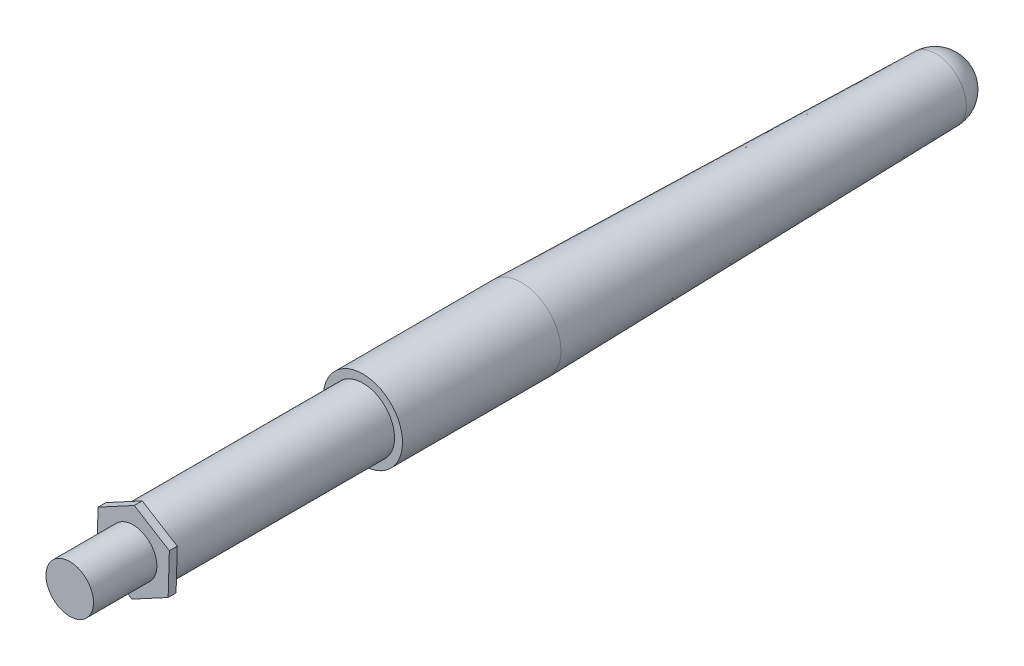
ISO-10303-21;
HEADER;
FILE_DESCRIPTION(('STEP AP214'),'2;1');
FILE_NAME('part.step','',(''),(''),'','','');
FILE_SCHEMA(('AUTOMOTIVE_DESIGN { 1 0 10303 214 1 1 1 1 }'));
ENDSEC;
DATA;
#1=APPLICATION_CONTEXT('core data for automotive mechanical design processes');
#2=APPLICATION_PROTOCOL_DEFINITION('international standard','automotive_design',2000,#1);
#3=PRODUCT_CONTEXT('',#1,'mechanical');
#4=PRODUCT('Part','Part','',(#3));
#5=PRODUCT_RELATED_PRODUCT_CATEGORY('part','',(#4));
#6=PRODUCT_DEFINITION_FORMATION('','',#4);
#7=PRODUCT_DEFINITION_CONTEXT('part definition',#1,'design');
#8=PRODUCT_DEFINITION('design','',#6,#7);
#9=PRODUCT_DEFINITION_SHAPE('','',#8);
#10=(LENGTH_UNIT() NAMED_UNIT(*) SI_UNIT(.MILLI.,.METRE.));
#11=(NAMED_UNIT(*) PLANE_ANGLE_UNIT() SI_UNIT($,.RADIAN.));
#12=(NAMED_UNIT(*) SI_UNIT($,.STERADIAN.) SOLID_ANGLE_UNIT());
#13=UNCERTAINTY_MEASURE_WITH_UNIT(LENGTH_MEASURE(1.E-05),#10,'distance_accuracy_value','');
#14=(GEOMETRIC_REPRESENTATION_CONTEXT(3) GLOBAL_UNCERTAINTY_ASSIGNED_CONTEXT((#13)) GLOBAL_UNIT_ASSIGNED_CONTEXT((#10,
#11,#12)) REPRESENTATION_CONTEXT('',''));
#15=CARTESIAN_POINT('',(0.,0.,0.));
#16=DIRECTION('',(0.,0.,1.));
#17=DIRECTION('',(1.,0.,0.));
#18=AXIS2_PLACEMENT_3D('',#15,#16,#17);
#19=CARTESIAN_POINT('',(0.,0.,-34.));
#20=DIRECTION('',(0.,0.,1.));
#21=DIRECTION('',(1.,0.,0.));
#22=AXIS2_PLACEMENT_3D('',#19,#20,#21);
#23=CYLINDRICAL_SURFACE('',#22,4.);
#24=CARTESIAN_POINT('',(0.,0.,-1.));
#25=DIRECTION('',(0.,0.,-1.));
#26=DIRECTION('',(-1.,0.,0.));
#27=AXIS2_PLACEMENT_3D('',#24,#25,#26);
#28=CIRCLE('',#27,4.);
#29=CARTESIAN_POINT('',(-4.,0.,-1.));
#30=VERTEX_POINT('',#29);
#31=EDGE_CURVE('E172',#30,#30,#28,.T.);
#32=ORIENTED_EDGE('',*,*,#31,.T.);
#33=EDGE_LOOP('',(#32));
#34=FACE_BOUND('',#33,.T.);
#35=CARTESIAN_POINT('',(0.,0.,-29.));
#36=DIRECTION('',(0.,0.,-1.));
#37=DIRECTION('',(-1.,0.,0.));
#38=AXIS2_PLACEMENT_3D('',#35,#36,#37);
#39=CIRCLE('',#38,4.);
#40=CARTESIAN_POINT('',(-4.,0.,-29.));
#41=VERTEX_POINT('',#40);
#42=EDGE_CURVE('E176',#41,#41,#39,.T.);
#43=ORIENTED_EDGE('',*,*,#42,.F.);
#44=EDGE_LOOP('',(#43));
#45=FACE_BOUND('',#44,.T.);
#46=ADVANCED_FACE('F45',(#34,#45),#23,.T.);
#47=CARTESIAN_POINT('',(0.,0.,8.));
#48=DIRECTION('',(0.,0.,-1.));
#49=DIRECTION('',(-1.,0.,0.));
#50=AXIS2_PLACEMENT_3D('',#47,#48,#49);
#51=CYLINDRICAL_SURFACE('',#50,3.);
#52=CARTESIAN_POINT('',(0.,0.,8.));
#53=DIRECTION('',(0.,0.,1.));
#54=DIRECTION('',(1.,0.,0.));
#55=AXIS2_PLACEMENT_3D('',#52,#53,#54);
#56=CIRCLE('',#55,3.);
#57=CARTESIAN_POINT('',(3.,0.,8.));
#58=VERTEX_POINT('',#57);
#59=EDGE_CURVE('E168',#58,#58,#56,.T.);
#60=ORIENTED_EDGE('',*,*,#59,.F.);
#61=EDGE_LOOP('',(#60));
#62=FACE_BOUND('',#61,.T.);
#63=CARTESIAN_POINT('',(0.,0.,0.));
#64=DIRECTION('',(0.,0.,1.));
#65=DIRECTION('',(1.,0.,0.));
#66=AXIS2_PLACEMENT_3D('',#63,#64,#65);
#67=CIRCLE('',#66,3.);
#68=CARTESIAN_POINT('',(3.,0.,0.));
#69=VERTEX_POINT('',#68);
#70=EDGE_CURVE('E167',#69,#69,#67,.T.);
#71=ORIENTED_EDGE('',*,*,#70,.T.);
#72=EDGE_LOOP('',(#71));
#73=FACE_BOUND('',#72,.T.);
#74=ADVANCED_FACE('F201',(#62,#73),#51,.T.);
#75=CARTESIAN_POINT('',(0.,0.,8.));
#76=DIRECTION('',(0.,0.,1.));
#77=DIRECTION('',(1.,0.,0.));
#78=AXIS2_PLACEMENT_3D('',#75,#76,#77);
#79=PLANE('',#78);
#80=ORIENTED_EDGE('',*,*,#59,.T.);
#81=EDGE_LOOP('',(#80));
#82=FACE_BOUND('',#81,.T.);
#83=ADVANCED_FACE('F207',(#82),#79,.T.);
#84=CARTESIAN_POINT('',(-4.57389900943464,-2.46565363575115,-1.));
#85=DIRECTION('',(0.99957413329399,-0.0291813647653501,0.));
#86=DIRECTION('',(0.0291813647653501,0.99957413329399,0.));
#87=AXIS2_PLACEMENT_3D('',#84,#85,#86);
#88=PLANE('',#87);
#89=DIRECTION('',(0.0291813647653501,0.99957413329399,0.));
#90=VECTOR('',#89,1.);
#91=CARTESIAN_POINT('',(-4.57389900943464,-2.46565363575115,0.));
#92=LINE('',#91,#90);
#93=CARTESIAN_POINT('',(-4.57389900943464,-2.46565363575115,0.));
#94=VERTEX_POINT('',#93);
#95=CARTESIAN_POINT('',(-4.42226819021128,2.7282859186393,0.));
#96=VERTEX_POINT('',#95);
#97=EDGE_CURVE('E136',#94,#96,#92,.T.);
#98=ORIENTED_EDGE('',*,*,#97,.T.);
#99=DIRECTION('',(0.,0.,1.));
#100=VECTOR('',#99,1.);
#101=CARTESIAN_POINT('',(-4.42226819021128,2.7282859186393,-1.));
#102=LINE('',#101,#100);
#103=CARTESIAN_POINT('',(-4.42226819021128,2.7282859186393,-1.));
#104=VERTEX_POINT('',#103);
#105=EDGE_CURVE('E164',#104,#96,#102,.T.);
#106=ORIENTED_EDGE('',*,*,#105,.F.);
#107=DIRECTION('',(0.0291813647653501,0.99957413329399,0.));
#108=VECTOR('',#107,1.);
#109=CARTESIAN_POINT('',(-4.57389900943464,-2.46565363575115,-1.));
#110=LINE('',#109,#108);
#111=CARTESIAN_POINT('',(-4.57389900943464,-2.46565363575115,-1.));
#112=VERTEX_POINT('',#111);
#113=EDGE_CURVE('E153',#112,#104,#110,.T.);
#114=ORIENTED_EDGE('',*,*,#113,.F.);
#115=DIRECTION('',(0.,0.,1.));
#116=VECTOR('',#115,1.);
#117=CARTESIAN_POINT('',(-4.57389900943464,-2.46565363575115,-1.));
#118=LINE('',#117,#116);
#119=EDGE_CURVE('E132',#112,#94,#118,.T.);
#120=ORIENTED_EDGE('',*,*,#119,.T.);
#121=EDGE_LOOP('',(#98,#106,#114,#120));
#122=FACE_BOUND('',#121,.T.);
#123=ADVANCED_FACE('F236',(#122),#88,.F.);
#124=CARTESIAN_POINT('',(-4.42226819021128,2.7282859186393,-1.));
#125=DIRECTION('',(0.474515263443102,-0.880247274781083,0.));
#126=DIRECTION('',(0.880247274781083,0.474515263443102,0.));
#127=AXIS2_PLACEMENT_3D('',#124,#125,#126);
#128=PLANE('',#127);
#129=DIRECTION('',(0.880247274781083,0.474515263443102,0.));
#130=VECTOR('',#129,1.);
#131=CARTESIAN_POINT('',(-4.42226819021128,2.7282859186393,0.));
#132=LINE('',#131,#130);
#133=CARTESIAN_POINT('',(0.151630819223359,5.19393955439045,0.));
#134=VERTEX_POINT('',#133);
#135=EDGE_CURVE('E140',#96,#134,#132,.T.);
#136=ORIENTED_EDGE('',*,*,#135,.T.);
#137=DIRECTION('',(0.,0.,1.));
#138=VECTOR('',#137,1.);
#139=CARTESIAN_POINT('',(0.151630819223359,5.19393955439045,-1.));
#140=LINE('',#139,#138);
#141=CARTESIAN_POINT('',(0.151630819223359,5.19393955439045,-1.));
#142=VERTEX_POINT('',#141);
#143=EDGE_CURVE('E160',#142,#134,#140,.T.);
#144=ORIENTED_EDGE('',*,*,#143,.F.);
#145=DIRECTION('',(0.880247274781083,0.474515263443102,0.));
#146=VECTOR('',#145,1.);
#147=CARTESIAN_POINT('',(-4.42226819021128,2.7282859186393,-1.));
#148=LINE('',#147,#146);
#149=EDGE_CURVE('E101',#104,#142,#148,.T.);
#150=ORIENTED_EDGE('',*,*,#149,.F.);
#151=ORIENTED_EDGE('',*,*,#105,.T.);
#152=EDGE_LOOP('',(#136,#144,#150,#151));
#153=FACE_BOUND('',#152,.T.);
#154=ADVANCED_FACE('F232',(#153),#128,.F.);
#155=CARTESIAN_POINT('',(0.151630819223359,5.19393955439045,-1.));
#156=DIRECTION('',(-0.525058869850889,-0.851065910015733,0.));
#157=DIRECTION('',(0.851065910015733,-0.525058869850889,0.));
#158=AXIS2_PLACEMENT_3D('',#155,#156,#157);
#159=PLANE('',#158);
#160=DIRECTION('',(0.851065910015733,-0.525058869850889,0.));
#161=VECTOR('',#160,1.);
#162=CARTESIAN_POINT('',(0.151630819223359,5.19393955439045,0.));
#163=LINE('',#162,#161);
#164=CARTESIAN_POINT('',(4.57389900943463,2.46565363575115,0.));
#165=VERTEX_POINT('',#164);
#166=EDGE_CURVE('E144',#134,#165,#163,.T.);
#167=ORIENTED_EDGE('',*,*,#166,.T.);
#168=DIRECTION('',(0.,0.,1.));
#169=VECTOR('',#168,1.);
#170=CARTESIAN_POINT('',(4.57389900943463,2.46565363575115,-1.));
#171=LINE('',#170,#169);
#172=CARTESIAN_POINT('',(4.57389900943463,2.46565363575115,-1.));
#173=VERTEX_POINT('',#172);
#174=EDGE_CURVE('E125',#173,#165,#171,.T.);
#175=ORIENTED_EDGE('',*,*,#174,.F.);
#176=DIRECTION('',(0.851065910015733,-0.525058869850889,0.));
#177=VECTOR('',#176,1.);
#178=CARTESIAN_POINT('',(0.151630819223359,5.19393955439045,-1.));
#179=LINE('',#178,#177);
#180=EDGE_CURVE('E114',#142,#173,#179,.T.);
#181=ORIENTED_EDGE('',*,*,#180,.F.);
#182=ORIENTED_EDGE('',*,*,#143,.T.);
#183=EDGE_LOOP('',(#167,#175,#181,#182));
#184=FACE_BOUND('',#183,.T.);
#185=ADVANCED_FACE('F229',(#184),#159,.F.);
#186=CARTESIAN_POINT('',(4.57389900943463,2.46565363575115,-1.));
#187=DIRECTION('',(-0.99957413329399,0.0291813647653501,0.));
#188=DIRECTION('',(-0.0291813647653501,-0.99957413329399,0.));
#189=AXIS2_PLACEMENT_3D('',#186,#187,#188);
#190=PLANE('',#189);
#191=DIRECTION('',(-0.0291813647653501,-0.99957413329399,0.));
#192=VECTOR('',#191,1.);
#193=CARTESIAN_POINT('',(4.57389900943463,2.46565363575115,0.));
#194=LINE('',#193,#192);
#195=CARTESIAN_POINT('',(4.42226819021128,-2.7282859186393,0.));
#196=VERTEX_POINT('',#195);
#197=EDGE_CURVE('E123',#165,#196,#194,.T.);
#198=ORIENTED_EDGE('',*,*,#197,.T.);
#199=DIRECTION('',(0.,0.,1.));
#200=VECTOR('',#199,1.);
#201=CARTESIAN_POINT('',(4.42226819021128,-2.7282859186393,-1.));
#202=LINE('',#201,#200);
#203=CARTESIAN_POINT('',(4.42226819021128,-2.7282859186393,-1.));
#204=VERTEX_POINT('',#203);
#205=EDGE_CURVE('E120',#204,#196,#202,.T.);
#206=ORIENTED_EDGE('',*,*,#205,.F.);
#207=DIRECTION('',(-0.0291813647653501,-0.99957413329399,0.));
#208=VECTOR('',#207,1.);
#209=CARTESIAN_POINT('',(4.57389900943463,2.46565363575115,-1.));
#210=LINE('',#209,#208);
#211=EDGE_CURVE('E108',#173,#204,#210,.T.);
#212=ORIENTED_EDGE('',*,*,#211,.F.);
#213=ORIENTED_EDGE('',*,*,#174,.T.);
#214=EDGE_LOOP('',(#198,#206,#212,#213));
#215=FACE_BOUND('',#214,.T.);
#216=ADVANCED_FACE('F121',(#215),#190,.F.);
#217=CARTESIAN_POINT('',(4.42226819021128,-2.7282859186393,-1.));
#218=DIRECTION('',(-0.474515263443102,0.880247274781083,0.));
#219=DIRECTION('',(-0.880247274781083,-0.474515263443102,0.));
#220=AXIS2_PLACEMENT_3D('',#217,#218,#219);
#221=PLANE('',#220);
#222=DIRECTION('',(-0.880247274781083,-0.474515263443102,0.));
#223=VECTOR('',#222,1.);
#224=CARTESIAN_POINT('',(4.42226819021128,-2.7282859186393,0.));
#225=LINE('',#224,#223);
#226=CARTESIAN_POINT('',(-0.15163081922336,-5.19393955439045,0.));
#227=VERTEX_POINT('',#226);
#228=EDGE_CURVE('E86',#196,#227,#225,.T.);
#229=ORIENTED_EDGE('',*,*,#228,.T.);
#230=DIRECTION('',(0.,0.,1.));
#231=VECTOR('',#230,1.);
#232=CARTESIAN_POINT('',(-0.15163081922336,-5.19393955439045,-1.));
#233=LINE('',#232,#231);
#234=CARTESIAN_POINT('',(-0.15163081922336,-5.19393955439045,-1.));
#235=VERTEX_POINT('',#234);
#236=EDGE_CURVE('E126',#235,#227,#233,.T.);
#237=ORIENTED_EDGE('',*,*,#236,.F.);
#238=DIRECTION('',(-0.880247274781083,-0.474515263443102,0.));
#239=VECTOR('',#238,1.);
#240=CARTESIAN_POINT('',(4.42226819021128,-2.7282859186393,-1.));
#241=LINE('',#240,#239);
#242=EDGE_CURVE('E112',#204,#235,#241,.T.);
#243=ORIENTED_EDGE('',*,*,#242,.F.);
#244=ORIENTED_EDGE('',*,*,#205,.T.);
#245=EDGE_LOOP('',(#229,#237,#243,#244));
#246=FACE_BOUND('',#245,.T.);
#247=ADVANCED_FACE('F128',(#246),#221,.F.);
#248=CARTESIAN_POINT('',(-0.15163081922336,-5.19393955439045,-1.));
#249=DIRECTION('',(0.525058869850889,0.851065910015733,0.));
#250=DIRECTION('',(-0.851065910015733,0.525058869850889,0.));
#251=AXIS2_PLACEMENT_3D('',#248,#249,#250);
#252=PLANE('',#251);
#253=DIRECTION('',(-0.851065910015733,0.525058869850889,0.));
#254=VECTOR('',#253,1.);
#255=CARTESIAN_POINT('',(-0.15163081922336,-5.19393955439045,0.));
#256=LINE('',#255,#254);
#257=EDGE_CURVE('E92',#227,#94,#256,.T.);
#258=ORIENTED_EDGE('',*,*,#257,.T.);
#259=ORIENTED_EDGE('',*,*,#119,.F.);
#260=DIRECTION('',(-0.851065910015733,0.525058869850889,0.));
#261=VECTOR('',#260,1.);
#262=CARTESIAN_POINT('',(-0.15163081922336,-5.19393955439045,-1.));
#263=LINE('',#262,#261);
#264=EDGE_CURVE('E63',#235,#112,#263,.T.);
#265=ORIENTED_EDGE('',*,*,#264,.F.);
#266=ORIENTED_EDGE('',*,*,#236,.T.);
#267=EDGE_LOOP('',(#258,#259,#265,#266));
#268=FACE_BOUND('',#267,.T.);
#269=ADVANCED_FACE('F218',(#268),#252,.F.);
#270=CARTESIAN_POINT('',(0.,0.,-1.));
#271=DIRECTION('',(0.,0.,-1.));
#272=DIRECTION('',(-1.,0.,0.));
#273=AXIS2_PLACEMENT_3D('',#270,#271,#272);
#274=PLANE('',#273);
#275=ORIENTED_EDGE('',*,*,#31,.F.);
#276=EDGE_LOOP('',(#275));
#277=FACE_BOUND('',#276,.T.);
#278=ORIENTED_EDGE('',*,*,#113,.T.);
#279=ORIENTED_EDGE('',*,*,#149,.T.);
#280=ORIENTED_EDGE('',*,*,#180,.T.);
#281=ORIENTED_EDGE('',*,*,#211,.T.);
#282=ORIENTED_EDGE('',*,*,#242,.T.);
#283=ORIENTED_EDGE('',*,*,#264,.T.);
#284=EDGE_LOOP('',(#278,#279,#280,#281,#282,#283));
#285=FACE_BOUND('',#284,.T.);
#286=ADVANCED_FACE('F110',(#277,#285),#274,.T.);
#287=CARTESIAN_POINT('',(0.,0.,0.));
#288=DIRECTION('',(0.,0.,-1.));
#289=DIRECTION('',(-1.,0.,0.));
#290=AXIS2_PLACEMENT_3D('',#287,#288,#289);
#291=PLANE('',#290);
#292=ORIENTED_EDGE('',*,*,#70,.F.);
#293=EDGE_LOOP('',(#292));
#294=FACE_BOUND('',#293,.T.);
#295=ORIENTED_EDGE('',*,*,#97,.F.);
#296=ORIENTED_EDGE('',*,*,#257,.F.);
#297=ORIENTED_EDGE('',*,*,#228,.F.);
#298=ORIENTED_EDGE('',*,*,#197,.F.);
#299=ORIENTED_EDGE('',*,*,#166,.F.);
#300=ORIENTED_EDGE('',*,*,#135,.F.);
#301=EDGE_LOOP('',(#295,#296,#297,#298,#299,#300));
#302=FACE_BOUND('',#301,.T.);
#303=ADVANCED_FACE('F217',(#294,#302),#291,.F.);
#304=CARTESIAN_POINT('',(0.,0.,-49.));
#305=DIRECTION('',(0.,0.,1.));
#306=DIRECTION('',(1.,0.,0.));
#307=AXIS2_PLACEMENT_3D('',#304,#305,#306);
#308=CYLINDRICAL_SURFACE('',#307,5.);
#309=CARTESIAN_POINT('',(0.,0.,-49.));
#310=DIRECTION('',(0.,0.,1.));
#311=DIRECTION('',(1.,0.,0.));
#312=AXIS2_PLACEMENT_3D('',#309,#310,#311);
#313=CIRCLE('',#312,5.);
#314=CARTESIAN_POINT('',(5.,0.,-49.));
#315=VERTEX_POINT('',#314);
#316=EDGE_CURVE('E141',#315,#315,#313,.F.);
#317=ORIENTED_EDGE('',*,*,#316,.F.);
#318=EDGE_LOOP('',(#317));
#319=FACE_BOUND('',#318,.T.);
#320=CARTESIAN_POINT('',(0.,0.,-29.));
#321=DIRECTION('',(0.,0.,-1.));
#322=DIRECTION('',(-1.,0.,0.));
#323=AXIS2_PLACEMENT_3D('',#320,#321,#322);
#324=CIRCLE('',#323,5.);
#325=CARTESIAN_POINT('',(-5.,0.,-29.));
#326=VERTEX_POINT('',#325);
#327=EDGE_CURVE('E183',#326,#326,#324,.T.);
#328=ORIENTED_EDGE('',*,*,#327,.T.);
#329=EDGE_LOOP('',(#328));
#330=FACE_BOUND('',#329,.T.);
#331=ADVANCED_FACE('F213',(#319,#330),#308,.T.);
#332=CARTESIAN_POINT('',(0.,0.,-29.));
#333=DIRECTION('',(0.,0.,-1.));
#334=DIRECTION('',(-1.,0.,0.));
#335=AXIS2_PLACEMENT_3D('',#332,#333,#334);
#336=PLANE('',#335);
#337=ORIENTED_EDGE('',*,*,#42,.T.);
#338=EDGE_LOOP('',(#337));
#339=FACE_BOUND('',#338,.T.);
#340=ORIENTED_EDGE('',*,*,#327,.F.);
#341=EDGE_LOOP('',(#340));
#342=FACE_BOUND('',#341,.T.);
#343=ADVANCED_FACE('F265',(#339,#342),#336,.F.);
#344=CARTESIAN_POINT('',(0.,0.,-105.));
#345=DIRECTION('',(0.,0.,-1.));
#346=DIRECTION('',(-1.,0.,0.));
#347=AXIS2_PLACEMENT_3D('',#344,#345,#346);
#348=PLANE('',#347);
#349=CARTESIAN_POINT('',(0.,0.,-105.));
#350=DIRECTION('',(0.,0.,-1.));
#351=DIRECTION('',(-1.,0.,0.));
#352=AXIS2_PLACEMENT_3D('',#349,#350,#351);
#353=CIRCLE('',#352,0.0827712619054573);
#354=CARTESIAN_POINT('',(-0.0827712619054573,0.,-105.));
#355=VERTEX_POINT('',#354);
#356=EDGE_CURVE('E55',#355,#355,#353,.T.);
#357=ORIENTED_EDGE('',*,*,#356,.T.);
#358=EDGE_LOOP('',(#357));
#359=FACE_BOUND('',#358,.T.);
#360=ADVANCED_FACE('F189',(#359),#348,.T.);
#361=CARTESIAN_POINT('',(0.,0.,-105.));
#362=DIRECTION('',(0.,0.,1.));
#363=DIRECTION('',(1.,0.,0.));
#364=AXIS2_PLACEMENT_3D('',#361,#362,#363);
#365=CONICAL_SURFACE('',#364,3.75,0.0223177224904992);
#366=CARTESIAN_POINT('',(0.,0.,-101.333684511995));
#367=DIRECTION('',(0.,0.,-1.));
#368=DIRECTION('',(-1.,0.,0.));
#369=AXIS2_PLACEMENT_3D('',#366,#367,#368);
#370=CIRCLE('',#369,3.83183739928582);
#371=CARTESIAN_POINT('',(-3.83183739928582,0.,-101.333684511995));
#372=VERTEX_POINT('',#371);
#373=EDGE_CURVE('E12',#372,#372,#370,.F.);
#374=ORIENTED_EDGE('',*,*,#373,.T.);
#375=EDGE_LOOP('',(#374));
#376=FACE_BOUND('',#375,.T.);
#377=ORIENTED_EDGE('',*,*,#316,.T.);
#378=EDGE_LOOP('',(#377));
#379=FACE_BOUND('',#378,.T.);
#380=ADVANCED_FACE('F192',(#376,#379),#365,.T.);
#381=CARTESIAN_POINT('',(0.,0.,-101.25));
#382=DIRECTION('',(0.,0.,-1.));
#383=DIRECTION('',(-1.,0.,0.));
#384=AXIS2_PLACEMENT_3D('',#381,#382,#383);
#385=DEGENERATE_TOROIDAL_SURFACE('',#384,0.0827712619054573,3.75,.T.);
#386=ORIENTED_EDGE('',*,*,#373,.F.);
#387=EDGE_LOOP('',(#386));
#388=FACE_BOUND('',#387,.T.);
#389=ORIENTED_EDGE('',*,*,#356,.F.);
#390=EDGE_LOOP('',(#389));
#391=FACE_BOUND('',#390,.T.);
#392=ADVANCED_FACE('F47',(#388,#391),#385,.T.);
#393=CLOSED_SHELL('',(#46,#74,#83,#123,#154,#185,#216,#247,#269,#286,#303,#331,#343,#360,#380,#392));
#394=MANIFOLD_SOLID_BREP('B2',#393);
#395=ADVANCED_BREP_SHAPE_REPRESENTATION('',(#18,#394),#14);
#396=SHAPE_DEFINITION_REPRESENTATION(#9,#395);
ENDSEC;
END-ISO-10303-21;
